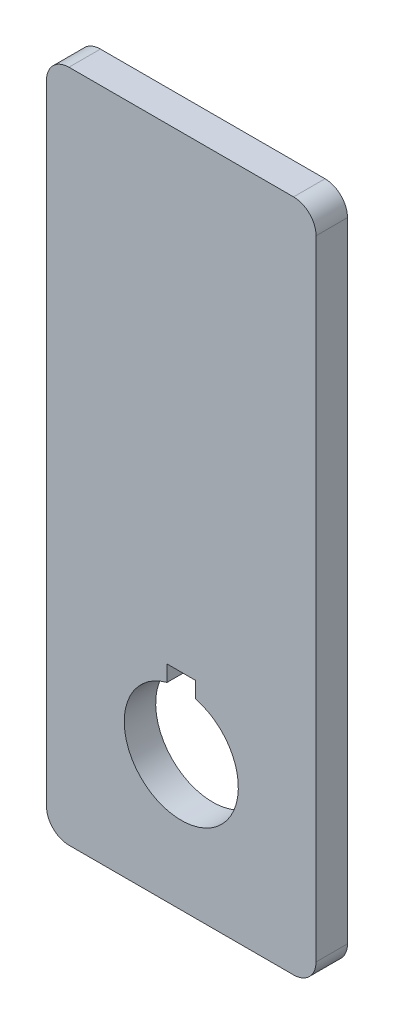
ISO-10303-21;
HEADER;
FILE_DESCRIPTION(('STEP AP214'),'2;1');
FILE_NAME('part.step','',(''),(''),'','','');
FILE_SCHEMA(('AUTOMOTIVE_DESIGN { 1 0 10303 214 1 1 1 1 }'));
ENDSEC;
DATA;
#1=APPLICATION_CONTEXT('core data for automotive mechanical design processes');
#2=APPLICATION_PROTOCOL_DEFINITION('international standard','automotive_design',2000,#1);
#3=PRODUCT_CONTEXT('',#1,'mechanical');
#4=PRODUCT('Part','Part','',(#3));
#5=PRODUCT_RELATED_PRODUCT_CATEGORY('part','',(#4));
#6=PRODUCT_DEFINITION_FORMATION('','',#4);
#7=PRODUCT_DEFINITION_CONTEXT('part definition',#1,'design');
#8=PRODUCT_DEFINITION('design','',#6,#7);
#9=PRODUCT_DEFINITION_SHAPE('','',#8);
#10=(LENGTH_UNIT() NAMED_UNIT(*) SI_UNIT(.MILLI.,.METRE.));
#11=(NAMED_UNIT(*) PLANE_ANGLE_UNIT() SI_UNIT($,.RADIAN.));
#12=(NAMED_UNIT(*) SI_UNIT($,.STERADIAN.) SOLID_ANGLE_UNIT());
#13=UNCERTAINTY_MEASURE_WITH_UNIT(LENGTH_MEASURE(1.E-05),#10,'distance_accuracy_value','');
#14=(GEOMETRIC_REPRESENTATION_CONTEXT(3) GLOBAL_UNCERTAINTY_ASSIGNED_CONTEXT((#13)) GLOBAL_UNIT_ASSIGNED_CONTEXT((#10,
#11,#12)) REPRESENTATION_CONTEXT('',''));
#15=CARTESIAN_POINT('',(0.,0.,0.));
#16=DIRECTION('',(0.,0.,1.));
#17=DIRECTION('',(1.,0.,0.));
#18=AXIS2_PLACEMENT_3D('',#15,#16,#17);
#19=CARTESIAN_POINT('',(25.,-25.,0.));
#20=DIRECTION('',(0.,0.,1.));
#21=DIRECTION('',(1.,0.,0.));
#22=AXIS2_PLACEMENT_3D('',#19,#20,#21);
#23=PLANE('',#22);
#24=DIRECTION('',(0.,-1.,0.));
#25=VECTOR('',#24,1.);
#26=CARTESIAN_POINT('',(-3.175,15.875,0.));
#27=LINE('',#26,#25);
#28=CARTESIAN_POINT('',(-3.175,15.875,0.));
#29=VERTEX_POINT('',#28);
#30=CARTESIAN_POINT('',(-3.175,12.2967221242086,0.));
#31=VERTEX_POINT('',#30);
#32=EDGE_CURVE('E95',#29,#31,#27,.T.);
#33=ORIENTED_EDGE('',*,*,#32,.T.);
#34=CARTESIAN_POINT('',(0.,0.,0.));
#35=DIRECTION('',(0.,0.,-1.));
#36=DIRECTION('',(-1.,0.,0.));
#37=AXIS2_PLACEMENT_3D('',#34,#35,#36);
#38=CIRCLE('',#37,12.7);
#39=CARTESIAN_POINT('',(3.175,12.2967221242086,0.));
#40=VERTEX_POINT('',#39);
#41=EDGE_CURVE('E20',#31,#40,#38,.F.);
#42=ORIENTED_EDGE('',*,*,#41,.T.);
#43=DIRECTION('',(0.,1.,0.));
#44=VECTOR('',#43,1.);
#45=CARTESIAN_POINT('',(3.175,15.875,0.));
#46=LINE('',#45,#44);
#47=CARTESIAN_POINT('',(3.175,15.875,0.));
#48=VERTEX_POINT('',#47);
#49=EDGE_CURVE('E103',#40,#48,#46,.T.);
#50=ORIENTED_EDGE('',*,*,#49,.T.);
#51=DIRECTION('',(1.,0.,0.));
#52=VECTOR('',#51,1.);
#53=CARTESIAN_POINT('',(3.175,15.875,0.));
#54=LINE('',#53,#52);
#55=EDGE_CURVE('E119',#48,#29,#54,.F.);
#56=ORIENTED_EDGE('',*,*,#55,.T.);
#57=EDGE_LOOP('',(#33,#42,#50,#56));
#58=FACE_BOUND('',#57,.T.);
#59=DIRECTION('',(1.,0.,0.));
#60=VECTOR('',#59,1.);
#61=CARTESIAN_POINT('',(-25.,-30.,0.));
#62=LINE('',#61,#60);
#63=CARTESIAN_POINT('',(25.,-30.,0.));
#64=VERTEX_POINT('',#63);
#65=CARTESIAN_POINT('',(-25.,-30.,0.));
#66=VERTEX_POINT('',#65);
#67=EDGE_CURVE('E135',#64,#66,#62,.F.);
#68=ORIENTED_EDGE('',*,*,#67,.T.);
#69=CARTESIAN_POINT('',(-25.,-25.,0.));
#70=DIRECTION('',(0.,0.,-1.));
#71=DIRECTION('',(-1.,0.,0.));
#72=AXIS2_PLACEMENT_3D('',#69,#70,#71);
#73=CIRCLE('',#72,5.);
#74=CARTESIAN_POINT('',(-30.,-25.,0.));
#75=VERTEX_POINT('',#74);
#76=EDGE_CURVE('E152',#75,#66,#73,.F.);
#77=ORIENTED_EDGE('',*,*,#76,.F.);
#78=DIRECTION('',(0.,1.,0.));
#79=VECTOR('',#78,1.);
#80=CARTESIAN_POINT('',(-30.,-25.,0.));
#81=LINE('',#80,#79);
#82=CARTESIAN_POINT('',(-30.,115.,0.));
#83=VERTEX_POINT('',#82);
#84=EDGE_CURVE('E149',#75,#83,#81,.T.);
#85=ORIENTED_EDGE('',*,*,#84,.T.);
#86=CARTESIAN_POINT('',(-25.,115.,0.));
#87=DIRECTION('',(0.,0.,-1.));
#88=DIRECTION('',(-1.,0.,0.));
#89=AXIS2_PLACEMENT_3D('',#86,#87,#88);
#90=CIRCLE('',#89,5.);
#91=CARTESIAN_POINT('',(-25.,120.,0.));
#92=VERTEX_POINT('',#91);
#93=EDGE_CURVE('E157',#92,#83,#90,.F.);
#94=ORIENTED_EDGE('',*,*,#93,.F.);
#95=DIRECTION('',(1.,0.,0.));
#96=VECTOR('',#95,1.);
#97=CARTESIAN_POINT('',(-25.,120.,0.));
#98=LINE('',#97,#96);
#99=CARTESIAN_POINT('',(25.,120.,0.));
#100=VERTEX_POINT('',#99);
#101=EDGE_CURVE('E154',#92,#100,#98,.T.);
#102=ORIENTED_EDGE('',*,*,#101,.T.);
#103=CARTESIAN_POINT('',(25.,115.,0.));
#104=DIRECTION('',(0.,0.,-1.));
#105=DIRECTION('',(-1.,0.,0.));
#106=AXIS2_PLACEMENT_3D('',#103,#104,#105);
#107=CIRCLE('',#106,5.);
#108=CARTESIAN_POINT('',(30.,115.,0.));
#109=VERTEX_POINT('',#108);
#110=EDGE_CURVE('E162',#109,#100,#107,.F.);
#111=ORIENTED_EDGE('',*,*,#110,.F.);
#112=DIRECTION('',(0.,1.,0.));
#113=VECTOR('',#112,1.);
#114=CARTESIAN_POINT('',(30.,-25.,0.));
#115=LINE('',#114,#113);
#116=CARTESIAN_POINT('',(30.,-25.,0.));
#117=VERTEX_POINT('',#116);
#118=EDGE_CURVE('E159',#109,#117,#115,.F.);
#119=ORIENTED_EDGE('',*,*,#118,.T.);
#120=CARTESIAN_POINT('',(25.,-25.,0.));
#121=DIRECTION('',(0.,0.,-1.));
#122=DIRECTION('',(-1.,0.,0.));
#123=AXIS2_PLACEMENT_3D('',#120,#121,#122);
#124=CIRCLE('',#123,5.);
#125=EDGE_CURVE('E193',#64,#117,#124,.F.);
#126=ORIENTED_EDGE('',*,*,#125,.F.);
#127=EDGE_LOOP('',(#68,#77,#85,#94,#102,#111,#119,#126));
#128=FACE_BOUND('',#127,.T.);
#129=ADVANCED_FACE('F17',(#58,#128),#23,.F.);
#130=CARTESIAN_POINT('',(-3.175,15.875,-3.));
#131=DIRECTION('',(-1.,0.,0.));
#132=DIRECTION('',(0.,-1.,0.));
#133=AXIS2_PLACEMENT_3D('',#130,#131,#132);
#134=PLANE('',#133);
#135=DIRECTION('',(0.,1.,0.));
#136=VECTOR('',#135,1.);
#137=CARTESIAN_POINT('',(-3.175,-25.,7.));
#138=LINE('',#137,#136);
#139=CARTESIAN_POINT('',(-3.175,12.2967221242086,7.));
#140=VERTEX_POINT('',#139);
#141=CARTESIAN_POINT('',(-3.175,15.875,7.));
#142=VERTEX_POINT('',#141);
#143=EDGE_CURVE('E133',#140,#142,#138,.T.);
#144=ORIENTED_EDGE('',*,*,#143,.F.);
#145=DIRECTION('',(0.,0.,-1.));
#146=VECTOR('',#145,1.);
#147=CARTESIAN_POINT('',(-3.175,12.2967221242086,7.));
#148=LINE('',#147,#146);
#149=EDGE_CURVE('E197',#140,#31,#148,.T.);
#150=ORIENTED_EDGE('',*,*,#149,.T.);
#151=ORIENTED_EDGE('',*,*,#32,.F.);
#152=DIRECTION('',(0.,0.,1.));
#153=VECTOR('',#152,1.);
#154=CARTESIAN_POINT('',(-3.175,15.875,-3.));
#155=LINE('',#154,#153);
#156=EDGE_CURVE('E142',#29,#142,#155,.T.);
#157=ORIENTED_EDGE('',*,*,#156,.T.);
#158=EDGE_LOOP('',(#144,#150,#151,#157));
#159=FACE_BOUND('',#158,.T.);
#160=ADVANCED_FACE('F340',(#159),#134,.F.);
#161=CARTESIAN_POINT('',(3.175,15.875,-3.));
#162=DIRECTION('',(0.,1.,0.));
#163=DIRECTION('',(0.,0.,1.));
#164=AXIS2_PLACEMENT_3D('',#161,#162,#163);
#165=PLANE('',#164);
#166=DIRECTION('',(1.,0.,0.));
#167=VECTOR('',#166,1.);
#168=CARTESIAN_POINT('',(25.,15.875,7.));
#169=LINE('',#168,#167);
#170=CARTESIAN_POINT('',(3.175,15.875,7.));
#171=VERTEX_POINT('',#170);
#172=EDGE_CURVE('E117',#142,#171,#169,.T.);
#173=ORIENTED_EDGE('',*,*,#172,.F.);
#174=ORIENTED_EDGE('',*,*,#156,.F.);
#175=ORIENTED_EDGE('',*,*,#55,.F.);
#176=DIRECTION('',(0.,0.,1.));
#177=VECTOR('',#176,1.);
#178=CARTESIAN_POINT('',(3.175,15.875,-3.));
#179=LINE('',#178,#177);
#180=EDGE_CURVE('E112',#48,#171,#179,.T.);
#181=ORIENTED_EDGE('',*,*,#180,.T.);
#182=EDGE_LOOP('',(#173,#174,#175,#181));
#183=FACE_BOUND('',#182,.T.);
#184=ADVANCED_FACE('F114',(#183),#165,.F.);
#185=CARTESIAN_POINT('',(3.175,15.875,-3.));
#186=DIRECTION('',(1.,0.,0.));
#187=DIRECTION('',(0.,1.,0.));
#188=AXIS2_PLACEMENT_3D('',#185,#186,#187);
#189=PLANE('',#188);
#190=DIRECTION('',(0.,1.,0.));
#191=VECTOR('',#190,1.);
#192=CARTESIAN_POINT('',(3.175,-25.,7.));
#193=LINE('',#192,#191);
#194=CARTESIAN_POINT('',(3.175,12.2967221242086,7.));
#195=VERTEX_POINT('',#194);
#196=EDGE_CURVE('E124',#171,#195,#193,.F.);
#197=ORIENTED_EDGE('',*,*,#196,.F.);
#198=ORIENTED_EDGE('',*,*,#180,.F.);
#199=ORIENTED_EDGE('',*,*,#49,.F.);
#200=DIRECTION('',(0.,0.,-1.));
#201=VECTOR('',#200,1.);
#202=CARTESIAN_POINT('',(3.175,12.2967221242086,7.));
#203=LINE('',#202,#201);
#204=EDGE_CURVE('E121',#40,#195,#203,.F.);
#205=ORIENTED_EDGE('',*,*,#204,.T.);
#206=EDGE_LOOP('',(#197,#198,#199,#205));
#207=FACE_BOUND('',#206,.T.);
#208=ADVANCED_FACE('F125',(#207),#189,.F.);
#209=CARTESIAN_POINT('',(0.,0.,7.));
#210=DIRECTION('',(0.,0.,-1.));
#211=DIRECTION('',(-1.,0.,0.));
#212=AXIS2_PLACEMENT_3D('',#209,#210,#211);
#213=CYLINDRICAL_SURFACE('',#212,12.7);
#214=ORIENTED_EDGE('',*,*,#149,.F.);
#215=CARTESIAN_POINT('',(0.,0.,7.));
#216=DIRECTION('',(0.,0.,-1.));
#217=DIRECTION('',(-1.,0.,0.));
#218=AXIS2_PLACEMENT_3D('',#215,#216,#217);
#219=CIRCLE('',#218,12.7);
#220=EDGE_CURVE('E129',#195,#140,#219,.T.);
#221=ORIENTED_EDGE('',*,*,#220,.F.);
#222=ORIENTED_EDGE('',*,*,#204,.F.);
#223=ORIENTED_EDGE('',*,*,#41,.F.);
#224=EDGE_LOOP('',(#214,#221,#222,#223));
#225=FACE_BOUND('',#224,.T.);
#226=ADVANCED_FACE('F314',(#225),#213,.F.);
#227=CARTESIAN_POINT('',(25.,-25.,7.));
#228=DIRECTION('',(0.,0.,-1.));
#229=DIRECTION('',(-1.,0.,0.));
#230=AXIS2_PLACEMENT_3D('',#227,#228,#229);
#231=CYLINDRICAL_SURFACE('',#230,5.);
#232=CARTESIAN_POINT('',(25.,-25.,7.));
#233=DIRECTION('',(0.,0.,-1.));
#234=DIRECTION('',(-1.,0.,0.));
#235=AXIS2_PLACEMENT_3D('',#232,#233,#234);
#236=CIRCLE('',#235,5.);
#237=CARTESIAN_POINT('',(25.,-30.,7.));
#238=VERTEX_POINT('',#237);
#239=CARTESIAN_POINT('',(30.,-25.,7.));
#240=VERTEX_POINT('',#239);
#241=EDGE_CURVE('E184',#238,#240,#236,.F.);
#242=ORIENTED_EDGE('',*,*,#241,.F.);
#243=DIRECTION('',(0.,0.,1.));
#244=VECTOR('',#243,1.);
#245=CARTESIAN_POINT('',(25.,-30.,7.));
#246=LINE('',#245,#244);
#247=EDGE_CURVE('E148',#238,#64,#246,.F.);
#248=ORIENTED_EDGE('',*,*,#247,.T.);
#249=ORIENTED_EDGE('',*,*,#125,.T.);
#250=DIRECTION('',(0.,0.,1.));
#251=VECTOR('',#250,1.);
#252=CARTESIAN_POINT('',(30.,-25.,7.));
#253=LINE('',#252,#251);
#254=EDGE_CURVE('E163',#117,#240,#253,.T.);
#255=ORIENTED_EDGE('',*,*,#254,.T.);
#256=EDGE_LOOP('',(#242,#248,#249,#255));
#257=FACE_BOUND('',#256,.T.);
#258=ADVANCED_FACE('F304',(#257),#231,.T.);
#259=CARTESIAN_POINT('',(30.,-25.,7.));
#260=DIRECTION('',(-1.,0.,0.));
#261=DIRECTION('',(0.,0.,1.));
#262=AXIS2_PLACEMENT_3D('',#259,#260,#261);
#263=PLANE('',#262);
#264=DIRECTION('',(0.,0.,-1.));
#265=VECTOR('',#264,1.);
#266=CARTESIAN_POINT('',(30.,115.,7.));
#267=LINE('',#266,#265);
#268=CARTESIAN_POINT('',(30.,115.,7.));
#269=VERTEX_POINT('',#268);
#270=EDGE_CURVE('E192',#269,#109,#267,.T.);
#271=ORIENTED_EDGE('',*,*,#270,.F.);
#272=DIRECTION('',(0.,1.,0.));
#273=VECTOR('',#272,1.);
#274=CARTESIAN_POINT('',(30.,-25.,7.));
#275=LINE('',#274,#273);
#276=EDGE_CURVE('E183',#240,#269,#275,.T.);
#277=ORIENTED_EDGE('',*,*,#276,.F.);
#278=ORIENTED_EDGE('',*,*,#254,.F.);
#279=ORIENTED_EDGE('',*,*,#118,.F.);
#280=EDGE_LOOP('',(#271,#277,#278,#279));
#281=FACE_BOUND('',#280,.T.);
#282=ADVANCED_FACE('F294',(#281),#263,.F.);
#283=CARTESIAN_POINT('',(25.,115.,7.));
#284=DIRECTION('',(0.,0.,-1.));
#285=DIRECTION('',(-1.,0.,0.));
#286=AXIS2_PLACEMENT_3D('',#283,#284,#285);
#287=CYLINDRICAL_SURFACE('',#286,5.);
#288=CARTESIAN_POINT('',(25.,115.,7.));
#289=DIRECTION('',(0.,0.,-1.));
#290=DIRECTION('',(-1.,0.,0.));
#291=AXIS2_PLACEMENT_3D('',#288,#289,#290);
#292=CIRCLE('',#291,5.);
#293=CARTESIAN_POINT('',(25.,120.,7.));
#294=VERTEX_POINT('',#293);
#295=EDGE_CURVE('E180',#269,#294,#292,.F.);
#296=ORIENTED_EDGE('',*,*,#295,.F.);
#297=ORIENTED_EDGE('',*,*,#270,.T.);
#298=ORIENTED_EDGE('',*,*,#110,.T.);
#299=DIRECTION('',(0.,0.,-1.));
#300=VECTOR('',#299,1.);
#301=CARTESIAN_POINT('',(25.,120.,7.));
#302=LINE('',#301,#300);
#303=EDGE_CURVE('E158',#100,#294,#302,.F.);
#304=ORIENTED_EDGE('',*,*,#303,.T.);
#305=EDGE_LOOP('',(#296,#297,#298,#304));
#306=FACE_BOUND('',#305,.T.);
#307=ADVANCED_FACE('F284',(#306),#287,.T.);
#308=CARTESIAN_POINT('',(-25.,120.,7.));
#309=DIRECTION('',(0.,-1.,0.));
#310=DIRECTION('',(0.,0.,-1.));
#311=AXIS2_PLACEMENT_3D('',#308,#309,#310);
#312=PLANE('',#311);
#313=DIRECTION('',(0.,0.,-1.));
#314=VECTOR('',#313,1.);
#315=CARTESIAN_POINT('',(-25.,120.,7.));
#316=LINE('',#315,#314);
#317=CARTESIAN_POINT('',(-25.,120.,7.));
#318=VERTEX_POINT('',#317);
#319=EDGE_CURVE('E191',#318,#92,#316,.T.);
#320=ORIENTED_EDGE('',*,*,#319,.F.);
#321=DIRECTION('',(1.,0.,0.));
#322=VECTOR('',#321,1.);
#323=CARTESIAN_POINT('',(25.,120.,7.));
#324=LINE('',#323,#322);
#325=EDGE_CURVE('E179',#294,#318,#324,.F.);
#326=ORIENTED_EDGE('',*,*,#325,.F.);
#327=ORIENTED_EDGE('',*,*,#303,.F.);
#328=ORIENTED_EDGE('',*,*,#101,.F.);
#329=EDGE_LOOP('',(#320,#326,#327,#328));
#330=FACE_BOUND('',#329,.T.);
#331=ADVANCED_FACE('F274',(#330),#312,.F.);
#332=CARTESIAN_POINT('',(-25.,115.,7.));
#333=DIRECTION('',(0.,0.,-1.));
#334=DIRECTION('',(-1.,0.,0.));
#335=AXIS2_PLACEMENT_3D('',#332,#333,#334);
#336=CYLINDRICAL_SURFACE('',#335,5.);
#337=CARTESIAN_POINT('',(-25.,115.,7.));
#338=DIRECTION('',(0.,0.,-1.));
#339=DIRECTION('',(-1.,0.,0.));
#340=AXIS2_PLACEMENT_3D('',#337,#338,#339);
#341=CIRCLE('',#340,5.);
#342=CARTESIAN_POINT('',(-30.,115.,7.));
#343=VERTEX_POINT('',#342);
#344=EDGE_CURVE('E176',#318,#343,#341,.F.);
#345=ORIENTED_EDGE('',*,*,#344,.F.);
#346=ORIENTED_EDGE('',*,*,#319,.T.);
#347=ORIENTED_EDGE('',*,*,#93,.T.);
#348=DIRECTION('',(0.,0.,-1.));
#349=VECTOR('',#348,1.);
#350=CARTESIAN_POINT('',(-30.,115.,7.));
#351=LINE('',#350,#349);
#352=EDGE_CURVE('E153',#83,#343,#351,.F.);
#353=ORIENTED_EDGE('',*,*,#352,.T.);
#354=EDGE_LOOP('',(#345,#346,#347,#353));
#355=FACE_BOUND('',#354,.T.);
#356=ADVANCED_FACE('F240',(#355),#336,.T.);
#357=CARTESIAN_POINT('',(-30.,-25.,7.));
#358=DIRECTION('',(1.,0.,0.));
#359=DIRECTION('',(0.,0.,-1.));
#360=AXIS2_PLACEMENT_3D('',#357,#358,#359);
#361=PLANE('',#360);
#362=DIRECTION('',(0.,0.,-1.));
#363=VECTOR('',#362,1.);
#364=CARTESIAN_POINT('',(-30.,-25.,7.));
#365=LINE('',#364,#363);
#366=CARTESIAN_POINT('',(-30.,-25.,7.));
#367=VERTEX_POINT('',#366);
#368=EDGE_CURVE('E189',#367,#75,#365,.T.);
#369=ORIENTED_EDGE('',*,*,#368,.F.);
#370=DIRECTION('',(0.,1.,0.));
#371=VECTOR('',#370,1.);
#372=CARTESIAN_POINT('',(-30.,-25.,7.));
#373=LINE('',#372,#371);
#374=EDGE_CURVE('E175',#343,#367,#373,.F.);
#375=ORIENTED_EDGE('',*,*,#374,.F.);
#376=ORIENTED_EDGE('',*,*,#352,.F.);
#377=ORIENTED_EDGE('',*,*,#84,.F.);
#378=EDGE_LOOP('',(#369,#375,#376,#377));
#379=FACE_BOUND('',#378,.T.);
#380=ADVANCED_FACE('F227',(#379),#361,.F.);
#381=CARTESIAN_POINT('',(-25.,-25.,7.));
#382=DIRECTION('',(0.,0.,-1.));
#383=DIRECTION('',(-1.,0.,0.));
#384=AXIS2_PLACEMENT_3D('',#381,#382,#383);
#385=CYLINDRICAL_SURFACE('',#384,5.);
#386=CARTESIAN_POINT('',(-25.,-25.,7.));
#387=DIRECTION('',(0.,0.,-1.));
#388=DIRECTION('',(-1.,0.,0.));
#389=AXIS2_PLACEMENT_3D('',#386,#387,#388);
#390=CIRCLE('',#389,5.);
#391=CARTESIAN_POINT('',(-25.,-30.,7.));
#392=VERTEX_POINT('',#391);
#393=EDGE_CURVE('E26',#367,#392,#390,.F.);
#394=ORIENTED_EDGE('',*,*,#393,.F.);
#395=ORIENTED_EDGE('',*,*,#368,.T.);
#396=ORIENTED_EDGE('',*,*,#76,.T.);
#397=DIRECTION('',(0.,0.,1.));
#398=VECTOR('',#397,1.);
#399=CARTESIAN_POINT('',(-25.,-30.,7.));
#400=LINE('',#399,#398);
#401=EDGE_CURVE('E35',#66,#392,#400,.T.);
#402=ORIENTED_EDGE('',*,*,#401,.T.);
#403=EDGE_LOOP('',(#394,#395,#396,#402));
#404=FACE_BOUND('',#403,.T.);
#405=ADVANCED_FACE('F229',(#404),#385,.T.);
#406=CARTESIAN_POINT('',(-25.,-30.,7.));
#407=DIRECTION('',(0.,1.,0.));
#408=DIRECTION('',(0.,0.,1.));
#409=AXIS2_PLACEMENT_3D('',#406,#407,#408);
#410=PLANE('',#409);
#411=ORIENTED_EDGE('',*,*,#247,.F.);
#412=DIRECTION('',(1.,0.,0.));
#413=VECTOR('',#412,1.);
#414=CARTESIAN_POINT('',(25.,-30.,7.));
#415=LINE('',#414,#413);
#416=EDGE_CURVE('E11',#392,#238,#415,.T.);
#417=ORIENTED_EDGE('',*,*,#416,.F.);
#418=ORIENTED_EDGE('',*,*,#401,.F.);
#419=ORIENTED_EDGE('',*,*,#67,.F.);
#420=EDGE_LOOP('',(#411,#417,#418,#419));
#421=FACE_BOUND('',#420,.T.);
#422=ADVANCED_FACE('F231',(#421),#410,.F.);
#423=CARTESIAN_POINT('',(25.,-25.,7.));
#424=DIRECTION('',(0.,0.,1.));
#425=DIRECTION('',(1.,0.,0.));
#426=AXIS2_PLACEMENT_3D('',#423,#424,#425);
#427=PLANE('',#426);
#428=ORIENTED_EDGE('',*,*,#393,.T.);
#429=ORIENTED_EDGE('',*,*,#416,.T.);
#430=ORIENTED_EDGE('',*,*,#241,.T.);
#431=ORIENTED_EDGE('',*,*,#276,.T.);
#432=ORIENTED_EDGE('',*,*,#295,.T.);
#433=ORIENTED_EDGE('',*,*,#325,.T.);
#434=ORIENTED_EDGE('',*,*,#344,.T.);
#435=ORIENTED_EDGE('',*,*,#374,.T.);
#436=EDGE_LOOP('',(#428,#429,#430,#431,#432,#433,#434,#435));
#437=FACE_BOUND('',#436,.T.);
#438=ORIENTED_EDGE('',*,*,#220,.T.);
#439=ORIENTED_EDGE('',*,*,#143,.T.);
#440=ORIENTED_EDGE('',*,*,#172,.T.);
#441=ORIENTED_EDGE('',*,*,#196,.T.);
#442=EDGE_LOOP('',(#438,#439,#440,#441));
#443=FACE_BOUND('',#442,.T.);
#444=ADVANCED_FACE('F131',(#437,#443),#427,.T.);
#445=CLOSED_SHELL('',(#129,#160,#184,#208,#226,#258,#282,#307,#331,#356,#380,#405,#422,#444));
#446=MANIFOLD_SOLID_BREP('B1',#445);
#447=ADVANCED_BREP_SHAPE_REPRESENTATION('',(#18,#446),#14);
#448=SHAPE_DEFINITION_REPRESENTATION(#9,#447);
ENDSEC;
END-ISO-10303-21;
